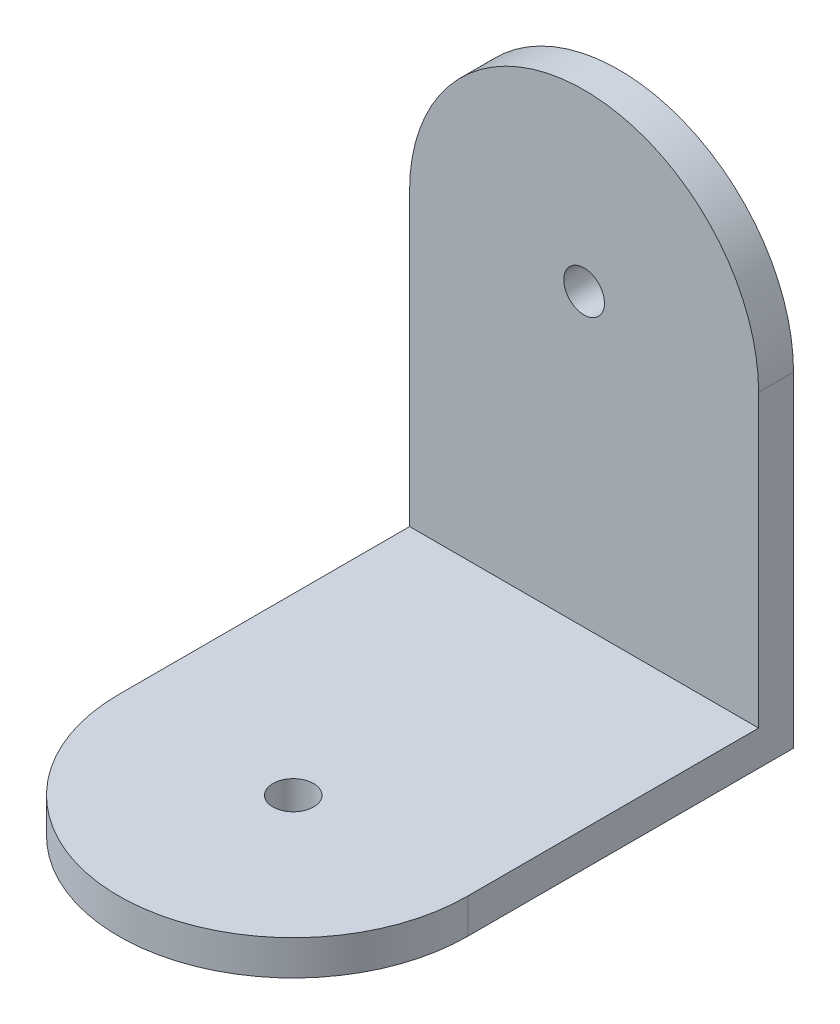
ISO-10303-21;
HEADER;
FILE_DESCRIPTION(('STEP AP214'),'2;1');
FILE_NAME('part.step','',(''),(''),'','','');
FILE_SCHEMA(('AUTOMOTIVE_DESIGN { 1 0 10303 214 1 1 1 1 }'));
ENDSEC;
DATA;
#1=APPLICATION_CONTEXT('core data for automotive mechanical design processes');
#2=APPLICATION_PROTOCOL_DEFINITION('international standard','automotive_design',2000,#1);
#3=PRODUCT_CONTEXT('',#1,'mechanical');
#4=PRODUCT('Part','Part','',(#3));
#5=PRODUCT_RELATED_PRODUCT_CATEGORY('part','',(#4));
#6=PRODUCT_DEFINITION_FORMATION('','',#4);
#7=PRODUCT_DEFINITION_CONTEXT('part definition',#1,'design');
#8=PRODUCT_DEFINITION('design','',#6,#7);
#9=PRODUCT_DEFINITION_SHAPE('','',#8);
#10=(LENGTH_UNIT() NAMED_UNIT(*) SI_UNIT(.MILLI.,.METRE.));
#11=(NAMED_UNIT(*) PLANE_ANGLE_UNIT() SI_UNIT($,.RADIAN.));
#12=(NAMED_UNIT(*) SI_UNIT($,.STERADIAN.) SOLID_ANGLE_UNIT());
#13=UNCERTAINTY_MEASURE_WITH_UNIT(LENGTH_MEASURE(1.E-05),#10,'distance_accuracy_value','');
#14=(GEOMETRIC_REPRESENTATION_CONTEXT(3) GLOBAL_UNCERTAINTY_ASSIGNED_CONTEXT((#13)) GLOBAL_UNIT_ASSIGNED_CONTEXT((#10,
#11,#12)) REPRESENTATION_CONTEXT('',''));
#15=CARTESIAN_POINT('',(0.,0.,0.));
#16=DIRECTION('',(0.,0.,1.));
#17=DIRECTION('',(1.,0.,0.));
#18=AXIS2_PLACEMENT_3D('',#15,#16,#17);
#19=CARTESIAN_POINT('',(15.,-13.6428211560459,43.));
#20=DIRECTION('',(0.,1.,0.));
#21=DIRECTION('',(0.,0.,1.));
#22=AXIS2_PLACEMENT_3D('',#19,#20,#21);
#23=PLANE('',#22);
#24=CARTESIAN_POINT('',(0.,-13.6428211560459,28.));
#25=DIRECTION('',(0.,1.,0.));
#26=DIRECTION('',(0.,0.,1.));
#27=AXIS2_PLACEMENT_3D('',#24,#25,#26);
#28=CIRCLE('',#27,1.75);
#29=CARTESIAN_POINT('',(0.,-13.6428211560459,29.75));
#30=VERTEX_POINT('',#29);
#31=EDGE_CURVE('E251',#30,#30,#28,.T.);
#32=ORIENTED_EDGE('',*,*,#31,.F.);
#33=EDGE_LOOP('',(#32));
#34=FACE_BOUND('',#33,.T.);
#35=DIRECTION('',(0.,0.,-1.));
#36=VECTOR('',#35,1.);
#37=CARTESIAN_POINT('',(-15.,-13.6428211560459,43.));
#38=LINE('',#37,#36);
#39=CARTESIAN_POINT('',(-15.,-13.6428211560459,28.));
#40=VERTEX_POINT('',#39);
#41=CARTESIAN_POINT('',(-15.,-13.6428211560459,3.));
#42=VERTEX_POINT('',#41);
#43=EDGE_CURVE('E113',#40,#42,#38,.T.);
#44=ORIENTED_EDGE('',*,*,#43,.F.);
#45=CARTESIAN_POINT('',(0.,-13.6428211560459,28.));
#46=DIRECTION('',(0.,1.,0.));
#47=DIRECTION('',(0.,0.,1.));
#48=AXIS2_PLACEMENT_3D('',#45,#46,#47);
#49=CIRCLE('',#48,15.);
#50=CARTESIAN_POINT('',(15.,-13.6428211560459,28.));
#51=VERTEX_POINT('',#50);
#52=EDGE_CURVE('E129',#40,#51,#49,.T.);
#53=ORIENTED_EDGE('',*,*,#52,.T.);
#54=DIRECTION('',(0.,0.,-1.));
#55=VECTOR('',#54,1.);
#56=CARTESIAN_POINT('',(15.,-13.6428211560459,43.));
#57=LINE('',#56,#55);
#58=CARTESIAN_POINT('',(15.,-13.6428211560459,3.));
#59=VERTEX_POINT('',#58);
#60=EDGE_CURVE('E123',#51,#59,#57,.T.);
#61=ORIENTED_EDGE('',*,*,#60,.T.);
#62=DIRECTION('',(1.,0.,0.));
#63=VECTOR('',#62,1.);
#64=CARTESIAN_POINT('',(0.,-13.6428211560459,3.));
#65=LINE('',#64,#63);
#66=EDGE_CURVE('E125',#42,#59,#65,.T.);
#67=ORIENTED_EDGE('',*,*,#66,.F.);
#68=EDGE_LOOP('',(#44,#53,#61,#67));
#69=FACE_BOUND('',#68,.T.);
#70=ADVANCED_FACE('F81',(#34,#69),#23,.T.);
#71=CARTESIAN_POINT('',(15.,-16.6428211560459,43.));
#72=DIRECTION('',(0.,-1.,0.));
#73=DIRECTION('',(0.,0.,-1.));
#74=AXIS2_PLACEMENT_3D('',#71,#72,#73);
#75=PLANE('',#74);
#76=CARTESIAN_POINT('',(0.,-16.6428211560459,28.));
#77=DIRECTION('',(0.,1.,0.));
#78=DIRECTION('',(0.,0.,1.));
#79=AXIS2_PLACEMENT_3D('',#76,#77,#78);
#80=CIRCLE('',#79,1.75);
#81=CARTESIAN_POINT('',(0.,-16.6428211560459,29.75));
#82=VERTEX_POINT('',#81);
#83=EDGE_CURVE('E228',#82,#82,#80,.T.);
#84=ORIENTED_EDGE('',*,*,#83,.T.);
#85=EDGE_LOOP('',(#84));
#86=FACE_BOUND('',#85,.T.);
#87=CARTESIAN_POINT('',(0.,-16.6428211560459,28.));
#88=DIRECTION('',(0.,1.,0.));
#89=DIRECTION('',(0.,0.,1.));
#90=AXIS2_PLACEMENT_3D('',#87,#88,#89);
#91=CIRCLE('',#90,15.);
#92=CARTESIAN_POINT('',(-15.,-16.6428211560459,28.));
#93=VERTEX_POINT('',#92);
#94=CARTESIAN_POINT('',(15.,-16.6428211560459,28.));
#95=VERTEX_POINT('',#94);
#96=EDGE_CURVE('E227',#93,#95,#91,.T.);
#97=ORIENTED_EDGE('',*,*,#96,.F.);
#98=DIRECTION('',(0.,0.,-1.));
#99=VECTOR('',#98,1.);
#100=CARTESIAN_POINT('',(-15.,-16.6428211560459,43.));
#101=LINE('',#100,#99);
#102=CARTESIAN_POINT('',(-15.,-16.6428211560459,0.));
#103=VERTEX_POINT('',#102);
#104=EDGE_CURVE('E225',#93,#103,#101,.T.);
#105=ORIENTED_EDGE('',*,*,#104,.T.);
#106=DIRECTION('',(-1.,0.,0.));
#107=VECTOR('',#106,1.);
#108=CARTESIAN_POINT('',(15.,-16.6428211560459,0.));
#109=LINE('',#108,#107);
#110=CARTESIAN_POINT('',(15.,-16.6428211560459,0.));
#111=VERTEX_POINT('',#110);
#112=EDGE_CURVE('E175',#111,#103,#109,.T.);
#113=ORIENTED_EDGE('',*,*,#112,.F.);
#114=DIRECTION('',(0.,0.,-1.));
#115=VECTOR('',#114,1.);
#116=CARTESIAN_POINT('',(15.,-16.6428211560459,43.));
#117=LINE('',#116,#115);
#118=EDGE_CURVE('E233',#95,#111,#117,.T.);
#119=ORIENTED_EDGE('',*,*,#118,.F.);
#120=EDGE_LOOP('',(#97,#105,#113,#119));
#121=FACE_BOUND('',#120,.T.);
#122=ADVANCED_FACE('F189',(#86,#121),#75,.T.);
#123=CARTESIAN_POINT('',(-15.,0.,3.));
#124=DIRECTION('',(1.,0.,0.));
#125=DIRECTION('',(0.,1.,0.));
#126=AXIS2_PLACEMENT_3D('',#123,#124,#125);
#127=PLANE('',#126);
#128=ORIENTED_EDGE('',*,*,#104,.F.);
#129=DIRECTION('',(0.,1.,0.));
#130=VECTOR('',#129,1.);
#131=CARTESIAN_POINT('',(-15.,-16.6428211560459,28.));
#132=LINE('',#131,#130);
#133=EDGE_CURVE('E219',#93,#40,#132,.T.);
#134=ORIENTED_EDGE('',*,*,#133,.T.);
#135=ORIENTED_EDGE('',*,*,#43,.T.);
#136=DIRECTION('',(0.,-1.,0.));
#137=VECTOR('',#136,1.);
#138=CARTESIAN_POINT('',(-15.,0.,3.));
#139=LINE('',#138,#137);
#140=CARTESIAN_POINT('',(-15.,11.3571788439541,3.));
#141=VERTEX_POINT('',#140);
#142=EDGE_CURVE('E141',#141,#42,#139,.T.);
#143=ORIENTED_EDGE('',*,*,#142,.F.);
#144=DIRECTION('',(0.,0.,-1.));
#145=VECTOR('',#144,1.);
#146=CARTESIAN_POINT('',(-15.,11.3571788439541,3.));
#147=LINE('',#146,#145);
#148=CARTESIAN_POINT('',(-15.,11.3571788439541,0.));
#149=VERTEX_POINT('',#148);
#150=EDGE_CURVE('E91',#141,#149,#147,.T.);
#151=ORIENTED_EDGE('',*,*,#150,.T.);
#152=DIRECTION('',(0.,-1.,0.));
#153=VECTOR('',#152,1.);
#154=CARTESIAN_POINT('',(-15.,0.,0.));
#155=LINE('',#154,#153);
#156=EDGE_CURVE('E155',#149,#103,#155,.T.);
#157=ORIENTED_EDGE('',*,*,#156,.T.);
#158=EDGE_LOOP('',(#128,#134,#135,#143,#151,#157));
#159=FACE_BOUND('',#158,.T.);
#160=ADVANCED_FACE('F170',(#159),#127,.F.);
#161=CARTESIAN_POINT('',(15.,0.,3.));
#162=DIRECTION('',(1.,0.,0.));
#163=DIRECTION('',(0.,1.,0.));
#164=AXIS2_PLACEMENT_3D('',#161,#162,#163);
#165=PLANE('',#164);
#166=DIRECTION('',(0.,1.,0.));
#167=VECTOR('',#166,1.);
#168=CARTESIAN_POINT('',(15.,-16.6428211560459,28.));
#169=LINE('',#168,#167);
#170=EDGE_CURVE('E220',#95,#51,#169,.T.);
#171=ORIENTED_EDGE('',*,*,#170,.F.);
#172=ORIENTED_EDGE('',*,*,#118,.T.);
#173=DIRECTION('',(0.,-1.,0.));
#174=VECTOR('',#173,1.);
#175=CARTESIAN_POINT('',(15.,0.,0.));
#176=LINE('',#175,#174);
#177=CARTESIAN_POINT('',(15.,11.3571788439541,0.));
#178=VERTEX_POINT('',#177);
#179=EDGE_CURVE('E159',#178,#111,#176,.T.);
#180=ORIENTED_EDGE('',*,*,#179,.F.);
#181=DIRECTION('',(0.,0.,-1.));
#182=VECTOR('',#181,1.);
#183=CARTESIAN_POINT('',(15.,11.3571788439541,3.));
#184=LINE('',#183,#182);
#185=CARTESIAN_POINT('',(15.,11.3571788439541,3.));
#186=VERTEX_POINT('',#185);
#187=EDGE_CURVE('E12',#186,#178,#184,.T.);
#188=ORIENTED_EDGE('',*,*,#187,.F.);
#189=DIRECTION('',(0.,-1.,0.));
#190=VECTOR('',#189,1.);
#191=CARTESIAN_POINT('',(15.,0.,3.));
#192=LINE('',#191,#190);
#193=EDGE_CURVE('E140',#186,#59,#192,.T.);
#194=ORIENTED_EDGE('',*,*,#193,.T.);
#195=ORIENTED_EDGE('',*,*,#60,.F.);
#196=EDGE_LOOP('',(#171,#172,#180,#188,#194,#195));
#197=FACE_BOUND('',#196,.T.);
#198=ADVANCED_FACE('F144',(#197),#165,.T.);
#199=CARTESIAN_POINT('',(0.,11.3571788439541,3.));
#200=DIRECTION('',(0.,0.,-1.));
#201=DIRECTION('',(-1.,0.,0.));
#202=AXIS2_PLACEMENT_3D('',#199,#200,#201);
#203=CYLINDRICAL_SURFACE('',#202,1.75);
#204=CARTESIAN_POINT('',(0.,11.3571788439541,3.));
#205=DIRECTION('',(0.,0.,1.));
#206=DIRECTION('',(1.,0.,0.));
#207=AXIS2_PLACEMENT_3D('',#204,#205,#206);
#208=CIRCLE('',#207,1.75);
#209=CARTESIAN_POINT('',(1.74999999999999,11.3571788439541,3.));
#210=VERTEX_POINT('',#209);
#211=EDGE_CURVE('E166',#210,#210,#208,.T.);
#212=ORIENTED_EDGE('',*,*,#211,.T.);
#213=EDGE_LOOP('',(#212));
#214=FACE_BOUND('',#213,.T.);
#215=CARTESIAN_POINT('',(0.,11.3571788439541,0.));
#216=DIRECTION('',(0.,0.,1.));
#217=DIRECTION('',(1.,0.,0.));
#218=AXIS2_PLACEMENT_3D('',#215,#216,#217);
#219=CIRCLE('',#218,1.75);
#220=CARTESIAN_POINT('',(1.74999999999999,11.3571788439541,0.));
#221=VERTEX_POINT('',#220);
#222=EDGE_CURVE('E134',#221,#221,#219,.T.);
#223=ORIENTED_EDGE('',*,*,#222,.F.);
#224=EDGE_LOOP('',(#223));
#225=FACE_BOUND('',#224,.T.);
#226=ADVANCED_FACE('F83',(#214,#225),#203,.F.);
#227=CARTESIAN_POINT('',(0.,11.3571788439541,3.));
#228=DIRECTION('',(0.,0.,-1.));
#229=DIRECTION('',(-1.,0.,0.));
#230=AXIS2_PLACEMENT_3D('',#227,#228,#229);
#231=CYLINDRICAL_SURFACE('',#230,15.);
#232=CARTESIAN_POINT('',(0.,11.3571788439541,0.));
#233=DIRECTION('',(0.,0.,1.));
#234=DIRECTION('',(1.,0.,0.));
#235=AXIS2_PLACEMENT_3D('',#232,#233,#234);
#236=CIRCLE('',#235,15.);
#237=EDGE_CURVE('E163',#149,#178,#236,.F.);
#238=ORIENTED_EDGE('',*,*,#237,.F.);
#239=ORIENTED_EDGE('',*,*,#150,.F.);
#240=CARTESIAN_POINT('',(0.,11.3571788439541,3.));
#241=DIRECTION('',(0.,0.,1.));
#242=DIRECTION('',(1.,0.,0.));
#243=AXIS2_PLACEMENT_3D('',#240,#241,#242);
#244=CIRCLE('',#243,15.);
#245=EDGE_CURVE('E146',#141,#186,#244,.F.);
#246=ORIENTED_EDGE('',*,*,#245,.T.);
#247=ORIENTED_EDGE('',*,*,#187,.T.);
#248=EDGE_LOOP('',(#238,#239,#246,#247));
#249=FACE_BOUND('',#248,.T.);
#250=ADVANCED_FACE('F176',(#249),#231,.T.);
#251=CARTESIAN_POINT('',(0.,0.,3.));
#252=DIRECTION('',(0.,0.,1.));
#253=DIRECTION('',(1.,0.,0.));
#254=AXIS2_PLACEMENT_3D('',#251,#252,#253);
#255=PLANE('',#254);
#256=ORIENTED_EDGE('',*,*,#211,.F.);
#257=EDGE_LOOP('',(#256));
#258=FACE_BOUND('',#257,.T.);
#259=ORIENTED_EDGE('',*,*,#142,.T.);
#260=ORIENTED_EDGE('',*,*,#66,.T.);
#261=ORIENTED_EDGE('',*,*,#193,.F.);
#262=ORIENTED_EDGE('',*,*,#245,.F.);
#263=EDGE_LOOP('',(#259,#260,#261,#262));
#264=FACE_BOUND('',#263,.T.);
#265=ADVANCED_FACE('F138',(#258,#264),#255,.T.);
#266=CARTESIAN_POINT('',(0.,0.,0.));
#267=DIRECTION('',(0.,0.,1.));
#268=DIRECTION('',(1.,0.,0.));
#269=AXIS2_PLACEMENT_3D('',#266,#267,#268);
#270=PLANE('',#269);
#271=ORIENTED_EDGE('',*,*,#222,.T.);
#272=EDGE_LOOP('',(#271));
#273=FACE_BOUND('',#272,.T.);
#274=ORIENTED_EDGE('',*,*,#156,.F.);
#275=ORIENTED_EDGE('',*,*,#237,.T.);
#276=ORIENTED_EDGE('',*,*,#179,.T.);
#277=ORIENTED_EDGE('',*,*,#112,.T.);
#278=EDGE_LOOP('',(#274,#275,#276,#277));
#279=FACE_BOUND('',#278,.T.);
#280=ADVANCED_FACE('F173',(#273,#279),#270,.F.);
#281=CARTESIAN_POINT('',(0.,-16.6428211560459,28.));
#282=DIRECTION('',(0.,1.,0.));
#283=DIRECTION('',(0.,0.,1.));
#284=AXIS2_PLACEMENT_3D('',#281,#282,#283);
#285=CYLINDRICAL_SURFACE('',#284,15.);
#286=ORIENTED_EDGE('',*,*,#52,.F.);
#287=ORIENTED_EDGE('',*,*,#133,.F.);
#288=ORIENTED_EDGE('',*,*,#96,.T.);
#289=ORIENTED_EDGE('',*,*,#170,.T.);
#290=EDGE_LOOP('',(#286,#287,#288,#289));
#291=FACE_BOUND('',#290,.T.);
#292=ADVANCED_FACE('F199',(#291),#285,.T.);
#293=CARTESIAN_POINT('',(0.,-16.6428211560459,28.));
#294=DIRECTION('',(0.,1.,0.));
#295=DIRECTION('',(0.,0.,1.));
#296=AXIS2_PLACEMENT_3D('',#293,#294,#295);
#297=CYLINDRICAL_SURFACE('',#296,1.75);
#298=ORIENTED_EDGE('',*,*,#83,.F.);
#299=EDGE_LOOP('',(#298));
#300=FACE_BOUND('',#299,.T.);
#301=ORIENTED_EDGE('',*,*,#31,.T.);
#302=EDGE_LOOP('',(#301));
#303=FACE_BOUND('',#302,.T.);
#304=ADVANCED_FACE('F206',(#300,#303),#297,.F.);
#305=CLOSED_SHELL('',(#70,#122,#160,#198,#226,#250,#265,#280,#292,#304));
#306=MANIFOLD_SOLID_BREP('B2',#305);
#307=ADVANCED_BREP_SHAPE_REPRESENTATION('',(#18,#306),#14);
#308=SHAPE_DEFINITION_REPRESENTATION(#9,#307);
ENDSEC;
END-ISO-10303-21;
